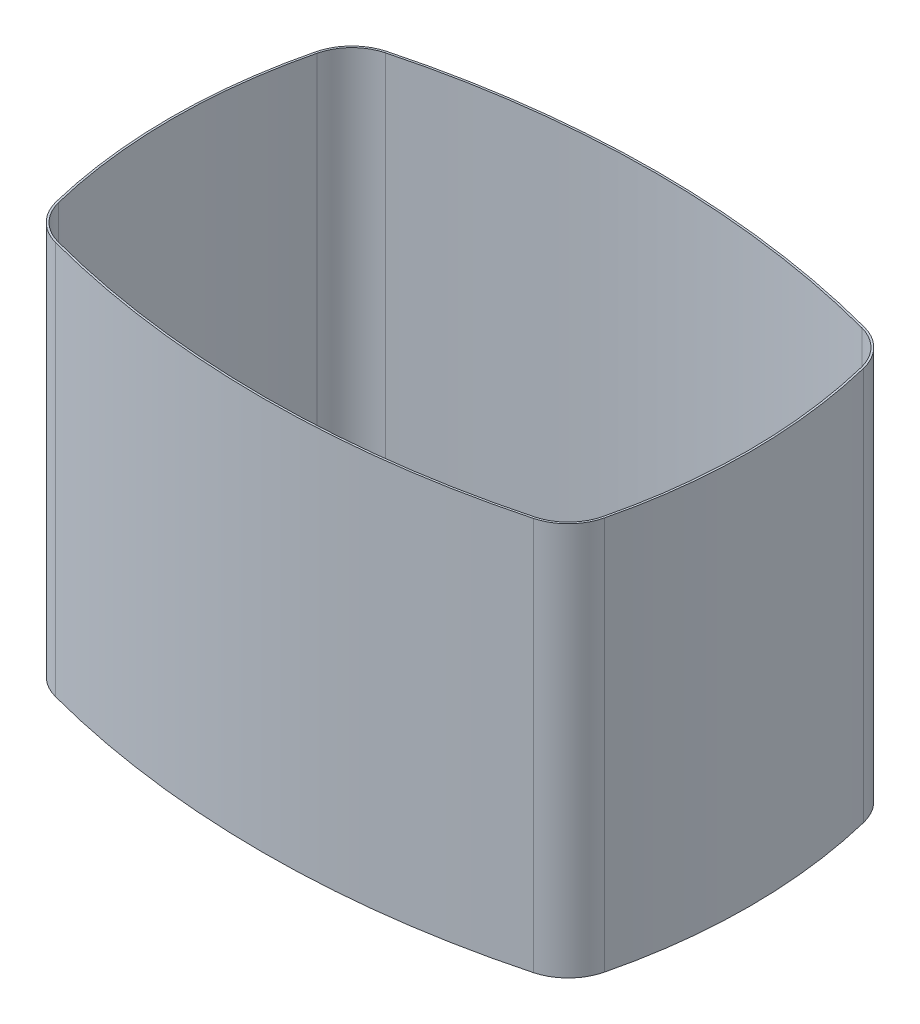
ISO-10303-21;
HEADER;
FILE_DESCRIPTION(('STEP AP214'),'2;1');
FILE_NAME('part.step','',(''),(''),'','','');
FILE_SCHEMA(('AUTOMOTIVE_DESIGN { 1 0 10303 214 1 1 1 1 }'));
ENDSEC;
DATA;
#1=APPLICATION_CONTEXT('core data for automotive mechanical design processes');
#2=APPLICATION_PROTOCOL_DEFINITION('international standard','automotive_design',2000,#1);
#3=PRODUCT_CONTEXT('',#1,'mechanical');
#4=PRODUCT('Part','Part','',(#3));
#5=PRODUCT_RELATED_PRODUCT_CATEGORY('part','',(#4));
#6=PRODUCT_DEFINITION_FORMATION('','',#4);
#7=PRODUCT_DEFINITION_CONTEXT('part definition',#1,'design');
#8=PRODUCT_DEFINITION('design','',#6,#7);
#9=PRODUCT_DEFINITION_SHAPE('','',#8);
#10=(LENGTH_UNIT() NAMED_UNIT(*) SI_UNIT(.MILLI.,.METRE.));
#11=(NAMED_UNIT(*) PLANE_ANGLE_UNIT() SI_UNIT($,.RADIAN.));
#12=(NAMED_UNIT(*) SI_UNIT($,.STERADIAN.) SOLID_ANGLE_UNIT());
#13=UNCERTAINTY_MEASURE_WITH_UNIT(LENGTH_MEASURE(1.E-05),#10,'distance_accuracy_value','');
#14=(GEOMETRIC_REPRESENTATION_CONTEXT(3) GLOBAL_UNCERTAINTY_ASSIGNED_CONTEXT((#13)) GLOBAL_UNIT_ASSIGNED_CONTEXT((#10,
#11,#12)) REPRESENTATION_CONTEXT('',''));
#15=CARTESIAN_POINT('',(0.,0.,0.));
#16=DIRECTION('',(0.,0.,1.));
#17=DIRECTION('',(1.,0.,0.));
#18=AXIS2_PLACEMENT_3D('',#15,#16,#17);
#19=CARTESIAN_POINT('',(0.,200.,373.542201676667));
#20=DIRECTION('',(0.,-1.,0.));
#21=DIRECTION('',(0.,0.,-1.));
#22=AXIS2_PLACEMENT_3D('',#19,#20,#21);
#23=CYLINDRICAL_SURFACE('',#22,473.535216716204);
#24=CARTESIAN_POINT('',(0.,0.,373.542201676667));
#25=DIRECTION('',(0.,1.,0.));
#26=DIRECTION('',(0.,0.,-1.));
#27=AXIS2_PLACEMENT_3D('',#24,#25,#26);
#28=CIRCLE('',#27,473.535216716204);
#29=CARTESIAN_POINT('',(121.409753109351,0.,-84.1643345672329));
#30=VERTEX_POINT('',#29);
#31=CARTESIAN_POINT('',(-121.409753109351,0.,-84.1643345672329));
#32=VERTEX_POINT('',#31);
#33=EDGE_CURVE('E188',#30,#32,#28,.T.);
#34=ORIENTED_EDGE('',*,*,#33,.T.);
#35=DIRECTION('',(0.,-1.,0.));
#36=VECTOR('',#35,1.);
#37=CARTESIAN_POINT('',(-121.409753109351,200.,-84.1643345672329));
#38=LINE('',#37,#36);
#39=CARTESIAN_POINT('',(-121.409753109351,200.,-84.1643345672329));
#40=VERTEX_POINT('',#39);
#41=EDGE_CURVE('E11',#40,#32,#38,.T.);
#42=ORIENTED_EDGE('',*,*,#41,.F.);
#43=CARTESIAN_POINT('',(0.,200.,373.542201676667));
#44=DIRECTION('',(0.,1.,0.));
#45=DIRECTION('',(0.,0.,-1.));
#46=AXIS2_PLACEMENT_3D('',#43,#44,#45);
#47=CIRCLE('',#46,473.535216716204);
#48=CARTESIAN_POINT('',(121.409753109351,200.,-84.1643345672329));
#49=VERTEX_POINT('',#48);
#50=EDGE_CURVE('E215',#49,#40,#47,.T.);
#51=ORIENTED_EDGE('',*,*,#50,.F.);
#52=DIRECTION('',(0.,-1.,0.));
#53=VECTOR('',#52,1.);
#54=CARTESIAN_POINT('',(121.409753109351,200.,-84.1643345672329));
#55=LINE('',#54,#53);
#56=EDGE_CURVE('E233',#49,#30,#55,.T.);
#57=ORIENTED_EDGE('',*,*,#56,.T.);
#58=EDGE_LOOP('',(#34,#42,#51,#57));
#59=FACE_BOUND('',#58,.T.);
#60=ADVANCED_FACE('F39',(#59),#23,.T.);
#61=CARTESIAN_POINT('',(-115.,200.,-60.));
#62=DIRECTION('',(0.,-1.,0.));
#63=DIRECTION('',(0.,0.,-1.));
#64=AXIS2_PLACEMENT_3D('',#61,#62,#63);
#65=CYLINDRICAL_SURFACE('',#64,25.);
#66=CARTESIAN_POINT('',(-115.,0.,-60.));
#67=DIRECTION('',(0.,1.,0.));
#68=DIRECTION('',(0.,0.,1.));
#69=AXIS2_PLACEMENT_3D('',#66,#67,#68);
#70=CIRCLE('',#69,25.);
#71=CARTESIAN_POINT('',(-139.283044384888,0.,-65.9442203358842));
#72=VERTEX_POINT('',#71);
#73=EDGE_CURVE('E236',#32,#72,#70,.T.);
#74=ORIENTED_EDGE('',*,*,#73,.T.);
#75=DIRECTION('',(0.,-1.,0.));
#76=VECTOR('',#75,1.);
#77=CARTESIAN_POINT('',(-139.283044384888,200.,-65.9442203358842));
#78=LINE('',#77,#76);
#79=CARTESIAN_POINT('',(-139.283044384888,200.,-65.9442203358842));
#80=VERTEX_POINT('',#79);
#81=EDGE_CURVE('E46',#80,#72,#78,.T.);
#82=ORIENTED_EDGE('',*,*,#81,.F.);
#83=CARTESIAN_POINT('',(-115.,200.,-60.));
#84=DIRECTION('',(0.,1.,0.));
#85=DIRECTION('',(0.,0.,1.));
#86=AXIS2_PLACEMENT_3D('',#83,#84,#85);
#87=CIRCLE('',#86,25.);
#88=EDGE_CURVE('E218',#40,#80,#87,.T.);
#89=ORIENTED_EDGE('',*,*,#88,.F.);
#90=ORIENTED_EDGE('',*,*,#41,.T.);
#91=EDGE_LOOP('',(#74,#82,#89,#90));
#92=FACE_BOUND('',#91,.T.);
#93=ADVANCED_FACE('F291',(#92),#65,.T.);
#94=CARTESIAN_POINT('',(130.109127987361,200.,0.));
#95=DIRECTION('',(0.,-1.,0.));
#96=DIRECTION('',(0.,0.,-1.));
#97=AXIS2_PLACEMENT_3D('',#94,#95,#96);
#98=CYLINDRICAL_SURFACE('',#97,277.345962168457);
#99=CARTESIAN_POINT('',(130.109127987361,0.,0.));
#100=DIRECTION('',(0.,1.,0.));
#101=DIRECTION('',(0.,0.,1.));
#102=AXIS2_PLACEMENT_3D('',#99,#100,#101);
#103=CIRCLE('',#102,277.345962168457);
#104=CARTESIAN_POINT('',(-139.283044384888,0.,65.944220335884));
#105=VERTEX_POINT('',#104);
#106=EDGE_CURVE('E238',#72,#105,#103,.T.);
#107=ORIENTED_EDGE('',*,*,#106,.T.);
#108=DIRECTION('',(0.,-1.,0.));
#109=VECTOR('',#108,1.);
#110=CARTESIAN_POINT('',(-139.283044384888,200.,65.944220335884));
#111=LINE('',#110,#109);
#112=CARTESIAN_POINT('',(-139.283044384888,200.,65.944220335884));
#113=VERTEX_POINT('',#112);
#114=EDGE_CURVE('E263',#113,#105,#111,.T.);
#115=ORIENTED_EDGE('',*,*,#114,.F.);
#116=CARTESIAN_POINT('',(130.109127987361,200.,0.));
#117=DIRECTION('',(0.,1.,0.));
#118=DIRECTION('',(0.,0.,1.));
#119=AXIS2_PLACEMENT_3D('',#116,#117,#118);
#120=CIRCLE('',#119,277.345962168457);
#121=EDGE_CURVE('E221',#80,#113,#120,.T.);
#122=ORIENTED_EDGE('',*,*,#121,.F.);
#123=ORIENTED_EDGE('',*,*,#81,.T.);
#124=EDGE_LOOP('',(#107,#115,#122,#123));
#125=FACE_BOUND('',#124,.T.);
#126=ADVANCED_FACE('F270',(#125),#98,.T.);
#127=CARTESIAN_POINT('',(-115.,200.,60.));
#128=DIRECTION('',(0.,-1.,0.));
#129=DIRECTION('',(0.,0.,-1.));
#130=AXIS2_PLACEMENT_3D('',#127,#128,#129);
#131=CYLINDRICAL_SURFACE('',#130,25.);
#132=CARTESIAN_POINT('',(-115.,0.,60.));
#133=DIRECTION('',(0.,1.,0.));
#134=DIRECTION('',(0.,0.,-1.));
#135=AXIS2_PLACEMENT_3D('',#132,#133,#134);
#136=CIRCLE('',#135,25.);
#137=CARTESIAN_POINT('',(-121.409753109351,0.,84.1643345672329));
#138=VERTEX_POINT('',#137);
#139=EDGE_CURVE('E240',#105,#138,#136,.T.);
#140=ORIENTED_EDGE('',*,*,#139,.T.);
#141=DIRECTION('',(0.,-1.,0.));
#142=VECTOR('',#141,1.);
#143=CARTESIAN_POINT('',(-121.409753109351,200.,84.1643345672329));
#144=LINE('',#143,#142);
#145=CARTESIAN_POINT('',(-121.409753109351,200.,84.1643345672329));
#146=VERTEX_POINT('',#145);
#147=EDGE_CURVE('E260',#146,#138,#144,.T.);
#148=ORIENTED_EDGE('',*,*,#147,.F.);
#149=CARTESIAN_POINT('',(-115.,200.,60.));
#150=DIRECTION('',(0.,1.,0.));
#151=DIRECTION('',(0.,0.,-1.));
#152=AXIS2_PLACEMENT_3D('',#149,#150,#151);
#153=CIRCLE('',#152,25.);
#154=EDGE_CURVE('E223',#113,#146,#153,.T.);
#155=ORIENTED_EDGE('',*,*,#154,.F.);
#156=ORIENTED_EDGE('',*,*,#114,.T.);
#157=EDGE_LOOP('',(#140,#148,#155,#156));
#158=FACE_BOUND('',#157,.T.);
#159=ADVANCED_FACE('F279',(#158),#131,.T.);
#160=CARTESIAN_POINT('',(0.,200.,-373.542201676667));
#161=DIRECTION('',(0.,-1.,0.));
#162=DIRECTION('',(0.,0.,-1.));
#163=AXIS2_PLACEMENT_3D('',#160,#161,#162);
#164=CYLINDRICAL_SURFACE('',#163,473.535216716204);
#165=CARTESIAN_POINT('',(0.,0.,-373.542201676667));
#166=DIRECTION('',(0.,1.,0.));
#167=DIRECTION('',(0.,0.,1.));
#168=AXIS2_PLACEMENT_3D('',#165,#166,#167);
#169=CIRCLE('',#168,473.535216716204);
#170=CARTESIAN_POINT('',(121.409753109351,0.,84.1643345672329));
#171=VERTEX_POINT('',#170);
#172=EDGE_CURVE('E242',#138,#171,#169,.T.);
#173=ORIENTED_EDGE('',*,*,#172,.T.);
#174=DIRECTION('',(0.,-1.,0.));
#175=VECTOR('',#174,1.);
#176=CARTESIAN_POINT('',(121.409753109351,200.,84.1643345672329));
#177=LINE('',#176,#175);
#178=CARTESIAN_POINT('',(121.409753109351,200.,84.1643345672329));
#179=VERTEX_POINT('',#178);
#180=EDGE_CURVE('E257',#179,#171,#177,.T.);
#181=ORIENTED_EDGE('',*,*,#180,.F.);
#182=CARTESIAN_POINT('',(0.,200.,-373.542201676667));
#183=DIRECTION('',(0.,1.,0.));
#184=DIRECTION('',(0.,0.,1.));
#185=AXIS2_PLACEMENT_3D('',#182,#183,#184);
#186=CIRCLE('',#185,473.535216716204);
#187=EDGE_CURVE('E225',#146,#179,#186,.T.);
#188=ORIENTED_EDGE('',*,*,#187,.F.);
#189=ORIENTED_EDGE('',*,*,#147,.T.);
#190=EDGE_LOOP('',(#173,#181,#188,#189));
#191=FACE_BOUND('',#190,.T.);
#192=ADVANCED_FACE('F283',(#191),#164,.T.);
#193=CARTESIAN_POINT('',(115.,200.,60.));
#194=DIRECTION('',(0.,-1.,0.));
#195=DIRECTION('',(0.,0.,-1.));
#196=AXIS2_PLACEMENT_3D('',#193,#194,#195);
#197=CYLINDRICAL_SURFACE('',#196,25.);
#198=CARTESIAN_POINT('',(115.,0.,60.));
#199=DIRECTION('',(0.,1.,0.));
#200=DIRECTION('',(0.,0.,1.));
#201=AXIS2_PLACEMENT_3D('',#198,#199,#200);
#202=CIRCLE('',#201,25.);
#203=CARTESIAN_POINT('',(139.283044384889,0.,65.9442203358839));
#204=VERTEX_POINT('',#203);
#205=EDGE_CURVE('E244',#171,#204,#202,.T.);
#206=ORIENTED_EDGE('',*,*,#205,.T.);
#207=DIRECTION('',(0.,-1.,0.));
#208=VECTOR('',#207,1.);
#209=CARTESIAN_POINT('',(139.283044384889,200.,65.9442203358839));
#210=LINE('',#209,#208);
#211=CARTESIAN_POINT('',(139.283044384889,200.,65.9442203358839));
#212=VERTEX_POINT('',#211);
#213=EDGE_CURVE('E254',#212,#204,#210,.T.);
#214=ORIENTED_EDGE('',*,*,#213,.F.);
#215=CARTESIAN_POINT('',(115.,200.,60.));
#216=DIRECTION('',(0.,1.,0.));
#217=DIRECTION('',(0.,0.,1.));
#218=AXIS2_PLACEMENT_3D('',#215,#216,#217);
#219=CIRCLE('',#218,25.);
#220=EDGE_CURVE('E227',#179,#212,#219,.T.);
#221=ORIENTED_EDGE('',*,*,#220,.F.);
#222=ORIENTED_EDGE('',*,*,#180,.T.);
#223=EDGE_LOOP('',(#206,#214,#221,#222));
#224=FACE_BOUND('',#223,.T.);
#225=ADVANCED_FACE('F304',(#224),#197,.T.);
#226=CARTESIAN_POINT('',(-130.109127987361,200.,1.13436230767317E-13));
#227=DIRECTION('',(0.,-1.,0.));
#228=DIRECTION('',(0.,0.,-1.));
#229=AXIS2_PLACEMENT_3D('',#226,#227,#228);
#230=CYLINDRICAL_SURFACE('',#229,277.345962168457);
#231=CARTESIAN_POINT('',(-130.109127987361,0.,1.13436230767317E-13));
#232=DIRECTION('',(0.,1.,0.));
#233=DIRECTION('',(0.,0.,-1.));
#234=AXIS2_PLACEMENT_3D('',#231,#232,#233);
#235=CIRCLE('',#234,277.345962168457);
#236=CARTESIAN_POINT('',(139.283044384888,0.,-65.9442203358842));
#237=VERTEX_POINT('',#236);
#238=EDGE_CURVE('E246',#204,#237,#235,.T.);
#239=ORIENTED_EDGE('',*,*,#238,.T.);
#240=DIRECTION('',(0.,-1.,0.));
#241=VECTOR('',#240,1.);
#242=CARTESIAN_POINT('',(139.283044384888,200.,-65.9442203358842));
#243=LINE('',#242,#241);
#244=CARTESIAN_POINT('',(139.283044384888,200.,-65.9442203358842));
#245=VERTEX_POINT('',#244);
#246=EDGE_CURVE('E251',#245,#237,#243,.T.);
#247=ORIENTED_EDGE('',*,*,#246,.F.);
#248=CARTESIAN_POINT('',(-130.109127987361,200.,1.13436230767317E-13));
#249=DIRECTION('',(0.,1.,0.));
#250=DIRECTION('',(0.,0.,-1.));
#251=AXIS2_PLACEMENT_3D('',#248,#249,#250);
#252=CIRCLE('',#251,277.345962168457);
#253=EDGE_CURVE('E229',#212,#245,#252,.T.);
#254=ORIENTED_EDGE('',*,*,#253,.F.);
#255=ORIENTED_EDGE('',*,*,#213,.T.);
#256=EDGE_LOOP('',(#239,#247,#254,#255));
#257=FACE_BOUND('',#256,.T.);
#258=ADVANCED_FACE('F302',(#257),#230,.T.);
#259=CARTESIAN_POINT('',(115.,200.,-60.));
#260=DIRECTION('',(0.,-1.,0.));
#261=DIRECTION('',(0.,0.,-1.));
#262=AXIS2_PLACEMENT_3D('',#259,#260,#261);
#263=CYLINDRICAL_SURFACE('',#262,25.);
#264=CARTESIAN_POINT('',(115.,0.,-60.));
#265=DIRECTION('',(0.,1.,0.));
#266=DIRECTION('',(0.,0.,-1.));
#267=AXIS2_PLACEMENT_3D('',#264,#265,#266);
#268=CIRCLE('',#267,25.);
#269=EDGE_CURVE('E219',#237,#30,#268,.T.);
#270=ORIENTED_EDGE('',*,*,#269,.T.);
#271=ORIENTED_EDGE('',*,*,#56,.F.);
#272=CARTESIAN_POINT('',(115.,200.,-60.));
#273=DIRECTION('',(0.,1.,0.));
#274=DIRECTION('',(0.,0.,-1.));
#275=AXIS2_PLACEMENT_3D('',#272,#273,#274);
#276=CIRCLE('',#275,25.);
#277=EDGE_CURVE('E231',#245,#49,#276,.T.);
#278=ORIENTED_EDGE('',*,*,#277,.F.);
#279=ORIENTED_EDGE('',*,*,#246,.T.);
#280=EDGE_LOOP('',(#270,#271,#278,#279));
#281=FACE_BOUND('',#280,.T.);
#282=ADVANCED_FACE('F297',(#281),#263,.T.);
#283=CARTESIAN_POINT('',(57.5,200.,156.771100838334));
#284=DIRECTION('',(0.,-1.,0.));
#285=DIRECTION('',(0.,0.,-1.));
#286=AXIS2_PLACEMENT_3D('',#283,#284,#285);
#287=PLANE('',#286);
#288=CARTESIAN_POINT('',(0.,200.,373.542201676667));
#289=DIRECTION('',(0.,-1.,0.));
#290=DIRECTION('',(0.,0.,-1.));
#291=AXIS2_PLACEMENT_3D('',#288,#289,#290);
#292=CIRCLE('',#291,472.535216716204);
#293=CARTESIAN_POINT('',(121.153362984977,200.,-83.1977611845436));
#294=VERTEX_POINT('',#293);
#295=CARTESIAN_POINT('',(-121.153362984977,200.,-83.1977611845436));
#296=VERTEX_POINT('',#295);
#297=EDGE_CURVE('E187',#294,#296,#292,.F.);
#298=ORIENTED_EDGE('',*,*,#297,.F.);
#299=CARTESIAN_POINT('',(115.,200.,-60.));
#300=DIRECTION('',(0.,-1.,0.));
#301=DIRECTION('',(0.,0.,-1.));
#302=AXIS2_PLACEMENT_3D('',#299,#300,#301);
#303=CIRCLE('',#302,24.);
#304=CARTESIAN_POINT('',(138.311722609493,200.,-65.7064515224489));
#305=VERTEX_POINT('',#304);
#306=EDGE_CURVE('E156',#305,#294,#303,.F.);
#307=ORIENTED_EDGE('',*,*,#306,.F.);
#308=CARTESIAN_POINT('',(-130.109127987361,200.,1.13436230767317E-13));
#309=DIRECTION('',(0.,-1.,0.));
#310=DIRECTION('',(0.,0.,-1.));
#311=AXIS2_PLACEMENT_3D('',#308,#309,#310);
#312=CIRCLE('',#311,276.345962168457);
#313=CARTESIAN_POINT('',(138.311722609493,200.,65.7064515224486));
#314=VERTEX_POINT('',#313);
#315=EDGE_CURVE('E212',#314,#305,#312,.F.);
#316=ORIENTED_EDGE('',*,*,#315,.F.);
#317=CARTESIAN_POINT('',(115.,200.,60.));
#318=DIRECTION('',(0.,-1.,0.));
#319=DIRECTION('',(0.,0.,-1.));
#320=AXIS2_PLACEMENT_3D('',#317,#318,#319);
#321=CIRCLE('',#320,24.);
#322=CARTESIAN_POINT('',(121.153362984977,200.,83.1977611845436));
#323=VERTEX_POINT('',#322);
#324=EDGE_CURVE('E210',#323,#314,#321,.F.);
#325=ORIENTED_EDGE('',*,*,#324,.F.);
#326=CARTESIAN_POINT('',(0.,200.,-373.542201676667));
#327=DIRECTION('',(0.,-1.,0.));
#328=DIRECTION('',(0.,0.,-1.));
#329=AXIS2_PLACEMENT_3D('',#326,#327,#328);
#330=CIRCLE('',#329,472.535216716204);
#331=CARTESIAN_POINT('',(-121.153362984977,200.,83.1977611845436));
#332=VERTEX_POINT('',#331);
#333=EDGE_CURVE('E208',#332,#323,#330,.F.);
#334=ORIENTED_EDGE('',*,*,#333,.F.);
#335=CARTESIAN_POINT('',(-115.,200.,60.));
#336=DIRECTION('',(0.,-1.,0.));
#337=DIRECTION('',(0.,0.,-1.));
#338=AXIS2_PLACEMENT_3D('',#335,#336,#337);
#339=CIRCLE('',#338,24.);
#340=CARTESIAN_POINT('',(-138.311722609493,200.,65.7064515224487));
#341=VERTEX_POINT('',#340);
#342=EDGE_CURVE('E206',#341,#332,#339,.F.);
#343=ORIENTED_EDGE('',*,*,#342,.F.);
#344=CARTESIAN_POINT('',(130.109127987361,200.,0.));
#345=DIRECTION('',(0.,-1.,0.));
#346=DIRECTION('',(0.,0.,-1.));
#347=AXIS2_PLACEMENT_3D('',#344,#345,#346);
#348=CIRCLE('',#347,276.345962168457);
#349=CARTESIAN_POINT('',(-138.311722609493,200.,-65.7064515224488));
#350=VERTEX_POINT('',#349);
#351=EDGE_CURVE('E204',#350,#341,#348,.F.);
#352=ORIENTED_EDGE('',*,*,#351,.F.);
#353=CARTESIAN_POINT('',(-115.,200.,-60.));
#354=DIRECTION('',(0.,-1.,0.));
#355=DIRECTION('',(0.,0.,-1.));
#356=AXIS2_PLACEMENT_3D('',#353,#354,#355);
#357=CIRCLE('',#356,24.);
#358=EDGE_CURVE('E202',#296,#350,#357,.F.);
#359=ORIENTED_EDGE('',*,*,#358,.F.);
#360=EDGE_LOOP('',(#298,#307,#316,#325,#334,#343,#352,#359));
#361=FACE_BOUND('',#360,.T.);
#362=ORIENTED_EDGE('',*,*,#50,.T.);
#363=ORIENTED_EDGE('',*,*,#88,.T.);
#364=ORIENTED_EDGE('',*,*,#121,.T.);
#365=ORIENTED_EDGE('',*,*,#154,.T.);
#366=ORIENTED_EDGE('',*,*,#187,.T.);
#367=ORIENTED_EDGE('',*,*,#220,.T.);
#368=ORIENTED_EDGE('',*,*,#253,.T.);
#369=ORIENTED_EDGE('',*,*,#277,.T.);
#370=EDGE_LOOP('',(#362,#363,#364,#365,#366,#367,#368,#369));
#371=FACE_BOUND('',#370,.T.);
#372=ADVANCED_FACE('F287',(#361,#371),#287,.F.);
#373=CARTESIAN_POINT('',(57.5,0.,156.771100838334));
#374=DIRECTION('',(0.,-1.,0.));
#375=DIRECTION('',(0.,0.,-1.));
#376=AXIS2_PLACEMENT_3D('',#373,#374,#375);
#377=PLANE('',#376);
#378=CARTESIAN_POINT('',(-115.,0.,-60.));
#379=DIRECTION('',(0.,-1.,0.));
#380=DIRECTION('',(0.,0.,-1.));
#381=AXIS2_PLACEMENT_3D('',#378,#379,#380);
#382=CIRCLE('',#381,24.);
#383=CARTESIAN_POINT('',(-138.311722609493,0.,-65.7064515224486));
#384=VERTEX_POINT('',#383);
#385=CARTESIAN_POINT('',(-121.153362984977,0.,-83.1977611845436));
#386=VERTEX_POINT('',#385);
#387=EDGE_CURVE('E164',#384,#386,#382,.T.);
#388=ORIENTED_EDGE('',*,*,#387,.F.);
#389=CARTESIAN_POINT('',(130.109127987361,0.,0.));
#390=DIRECTION('',(0.,-1.,0.));
#391=DIRECTION('',(0.,0.,-1.));
#392=AXIS2_PLACEMENT_3D('',#389,#390,#391);
#393=CIRCLE('',#392,276.345962168457);
#394=CARTESIAN_POINT('',(-138.311722609493,0.,65.7064515224486));
#395=VERTEX_POINT('',#394);
#396=EDGE_CURVE('E184',#395,#384,#393,.T.);
#397=ORIENTED_EDGE('',*,*,#396,.F.);
#398=CARTESIAN_POINT('',(-115.,0.,60.));
#399=DIRECTION('',(0.,-1.,0.));
#400=DIRECTION('',(0.,0.,-1.));
#401=AXIS2_PLACEMENT_3D('',#398,#399,#400);
#402=CIRCLE('',#401,24.);
#403=CARTESIAN_POINT('',(-121.153362984977,0.,83.1977611845436));
#404=VERTEX_POINT('',#403);
#405=EDGE_CURVE('E181',#404,#395,#402,.T.);
#406=ORIENTED_EDGE('',*,*,#405,.F.);
#407=CARTESIAN_POINT('',(0.,0.,-373.542201676667));
#408=DIRECTION('',(0.,-1.,0.));
#409=DIRECTION('',(0.,0.,-1.));
#410=AXIS2_PLACEMENT_3D('',#407,#408,#409);
#411=CIRCLE('',#410,472.535216716204);
#412=CARTESIAN_POINT('',(121.153362984977,0.,83.1977611845437));
#413=VERTEX_POINT('',#412);
#414=EDGE_CURVE('E178',#413,#404,#411,.T.);
#415=ORIENTED_EDGE('',*,*,#414,.F.);
#416=CARTESIAN_POINT('',(115.,0.,60.));
#417=DIRECTION('',(0.,-1.,0.));
#418=DIRECTION('',(0.,0.,-1.));
#419=AXIS2_PLACEMENT_3D('',#416,#417,#418);
#420=CIRCLE('',#419,24.);
#421=CARTESIAN_POINT('',(138.311722609493,0.,65.7064515224486));
#422=VERTEX_POINT('',#421);
#423=EDGE_CURVE('E172',#422,#413,#420,.T.);
#424=ORIENTED_EDGE('',*,*,#423,.F.);
#425=CARTESIAN_POINT('',(-130.109127987361,0.,1.13436230767317E-13));
#426=DIRECTION('',(0.,-1.,0.));
#427=DIRECTION('',(0.,0.,-1.));
#428=AXIS2_PLACEMENT_3D('',#425,#426,#427);
#429=CIRCLE('',#428,276.345962168457);
#430=CARTESIAN_POINT('',(138.311722609493,0.,-65.7064515224489));
#431=VERTEX_POINT('',#430);
#432=EDGE_CURVE('E170',#431,#422,#429,.T.);
#433=ORIENTED_EDGE('',*,*,#432,.F.);
#434=CARTESIAN_POINT('',(115.,0.,-60.));
#435=DIRECTION('',(0.,-1.,0.));
#436=DIRECTION('',(0.,0.,-1.));
#437=AXIS2_PLACEMENT_3D('',#434,#435,#436);
#438=CIRCLE('',#437,24.);
#439=CARTESIAN_POINT('',(121.153362984977,0.,-83.1977611845437));
#440=VERTEX_POINT('',#439);
#441=EDGE_CURVE('E153',#440,#431,#438,.T.);
#442=ORIENTED_EDGE('',*,*,#441,.F.);
#443=CARTESIAN_POINT('',(0.,0.,373.542201676667));
#444=DIRECTION('',(0.,-1.,0.));
#445=DIRECTION('',(0.,0.,-1.));
#446=AXIS2_PLACEMENT_3D('',#443,#444,#445);
#447=CIRCLE('',#446,472.535216716204);
#448=EDGE_CURVE('E160',#386,#440,#447,.T.);
#449=ORIENTED_EDGE('',*,*,#448,.F.);
#450=EDGE_LOOP('',(#388,#397,#406,#415,#424,#433,#442,#449));
#451=FACE_BOUND('',#450,.T.);
#452=ORIENTED_EDGE('',*,*,#33,.F.);
#453=ORIENTED_EDGE('',*,*,#269,.F.);
#454=ORIENTED_EDGE('',*,*,#238,.F.);
#455=ORIENTED_EDGE('',*,*,#205,.F.);
#456=ORIENTED_EDGE('',*,*,#172,.F.);
#457=ORIENTED_EDGE('',*,*,#139,.F.);
#458=ORIENTED_EDGE('',*,*,#106,.F.);
#459=ORIENTED_EDGE('',*,*,#73,.F.);
#460=EDGE_LOOP('',(#452,#453,#454,#455,#456,#457,#458,#459));
#461=FACE_BOUND('',#460,.T.);
#462=ADVANCED_FACE('F166',(#451,#461),#377,.T.);
#463=CARTESIAN_POINT('',(0.,200.,373.542201676667));
#464=DIRECTION('',(0.,-1.,0.));
#465=DIRECTION('',(0.,0.,-1.));
#466=AXIS2_PLACEMENT_3D('',#463,#464,#465);
#467=CYLINDRICAL_SURFACE('',#466,472.535216716204);
#468=DIRECTION('',(0.,-1.,0.));
#469=VECTOR('',#468,1.);
#470=CARTESIAN_POINT('',(-121.153362984977,200.,-83.1977611845436));
#471=LINE('',#470,#469);
#472=EDGE_CURVE('E53',#296,#386,#471,.T.);
#473=ORIENTED_EDGE('',*,*,#472,.T.);
#474=ORIENTED_EDGE('',*,*,#448,.T.);
#475=DIRECTION('',(0.,-1.,0.));
#476=VECTOR('',#475,1.);
#477=CARTESIAN_POINT('',(121.153362984977,200.,-83.1977611845436));
#478=LINE('',#477,#476);
#479=EDGE_CURVE('E150',#294,#440,#478,.T.);
#480=ORIENTED_EDGE('',*,*,#479,.F.);
#481=ORIENTED_EDGE('',*,*,#297,.T.);
#482=EDGE_LOOP('',(#473,#474,#480,#481));
#483=FACE_BOUND('',#482,.T.);
#484=ADVANCED_FACE('F161',(#483),#467,.F.);
#485=CARTESIAN_POINT('',(-115.,200.,-60.));
#486=DIRECTION('',(0.,-1.,0.));
#487=DIRECTION('',(0.,0.,-1.));
#488=AXIS2_PLACEMENT_3D('',#485,#486,#487);
#489=CYLINDRICAL_SURFACE('',#488,24.);
#490=DIRECTION('',(0.,-1.,0.));
#491=VECTOR('',#490,1.);
#492=CARTESIAN_POINT('',(-138.311722609493,200.,-65.7064515224489));
#493=LINE('',#492,#491);
#494=EDGE_CURVE('E189',#350,#384,#493,.T.);
#495=ORIENTED_EDGE('',*,*,#494,.T.);
#496=ORIENTED_EDGE('',*,*,#387,.T.);
#497=ORIENTED_EDGE('',*,*,#472,.F.);
#498=ORIENTED_EDGE('',*,*,#358,.T.);
#499=EDGE_LOOP('',(#495,#496,#497,#498));
#500=FACE_BOUND('',#499,.T.);
#501=ADVANCED_FACE('F382',(#500),#489,.F.);
#502=CARTESIAN_POINT('',(130.109127987361,200.,0.));
#503=DIRECTION('',(0.,-1.,0.));
#504=DIRECTION('',(0.,0.,-1.));
#505=AXIS2_PLACEMENT_3D('',#502,#503,#504);
#506=CYLINDRICAL_SURFACE('',#505,276.345962168457);
#507=DIRECTION('',(0.,-1.,0.));
#508=VECTOR('',#507,1.);
#509=CARTESIAN_POINT('',(-138.311722609493,200.,65.7064515224486));
#510=LINE('',#509,#508);
#511=EDGE_CURVE('E192',#341,#395,#510,.T.);
#512=ORIENTED_EDGE('',*,*,#511,.T.);
#513=ORIENTED_EDGE('',*,*,#396,.T.);
#514=ORIENTED_EDGE('',*,*,#494,.F.);
#515=ORIENTED_EDGE('',*,*,#351,.T.);
#516=EDGE_LOOP('',(#512,#513,#514,#515));
#517=FACE_BOUND('',#516,.T.);
#518=ADVANCED_FACE('F392',(#517),#506,.F.);
#519=CARTESIAN_POINT('',(-115.,200.,60.));
#520=DIRECTION('',(0.,-1.,0.));
#521=DIRECTION('',(0.,0.,-1.));
#522=AXIS2_PLACEMENT_3D('',#519,#520,#521);
#523=CYLINDRICAL_SURFACE('',#522,24.);
#524=DIRECTION('',(0.,-1.,0.));
#525=VECTOR('',#524,1.);
#526=CARTESIAN_POINT('',(-121.153362984977,200.,83.1977611845436));
#527=LINE('',#526,#525);
#528=EDGE_CURVE('E194',#332,#404,#527,.T.);
#529=ORIENTED_EDGE('',*,*,#528,.T.);
#530=ORIENTED_EDGE('',*,*,#405,.T.);
#531=ORIENTED_EDGE('',*,*,#511,.F.);
#532=ORIENTED_EDGE('',*,*,#342,.T.);
#533=EDGE_LOOP('',(#529,#530,#531,#532));
#534=FACE_BOUND('',#533,.T.);
#535=ADVANCED_FACE('F403',(#534),#523,.F.);
#536=CARTESIAN_POINT('',(0.,200.,-373.542201676667));
#537=DIRECTION('',(0.,-1.,0.));
#538=DIRECTION('',(0.,0.,-1.));
#539=AXIS2_PLACEMENT_3D('',#536,#537,#538);
#540=CYLINDRICAL_SURFACE('',#539,472.535216716204);
#541=DIRECTION('',(0.,-1.,0.));
#542=VECTOR('',#541,1.);
#543=CARTESIAN_POINT('',(121.153362984977,200.,83.1977611845437));
#544=LINE('',#543,#542);
#545=EDGE_CURVE('E196',#323,#413,#544,.T.);
#546=ORIENTED_EDGE('',*,*,#545,.T.);
#547=ORIENTED_EDGE('',*,*,#414,.T.);
#548=ORIENTED_EDGE('',*,*,#528,.F.);
#549=ORIENTED_EDGE('',*,*,#333,.T.);
#550=EDGE_LOOP('',(#546,#547,#548,#549));
#551=FACE_BOUND('',#550,.T.);
#552=ADVANCED_FACE('F414',(#551),#540,.F.);
#553=CARTESIAN_POINT('',(115.,200.,60.));
#554=DIRECTION('',(0.,-1.,0.));
#555=DIRECTION('',(0.,0.,-1.));
#556=AXIS2_PLACEMENT_3D('',#553,#554,#555);
#557=CYLINDRICAL_SURFACE('',#556,24.);
#558=DIRECTION('',(0.,-1.,0.));
#559=VECTOR('',#558,1.);
#560=CARTESIAN_POINT('',(138.311722609493,200.,65.7064515224486));
#561=LINE('',#560,#559);
#562=EDGE_CURVE('E198',#314,#422,#561,.T.);
#563=ORIENTED_EDGE('',*,*,#562,.T.);
#564=ORIENTED_EDGE('',*,*,#423,.T.);
#565=ORIENTED_EDGE('',*,*,#545,.F.);
#566=ORIENTED_EDGE('',*,*,#324,.T.);
#567=EDGE_LOOP('',(#563,#564,#565,#566));
#568=FACE_BOUND('',#567,.T.);
#569=ADVANCED_FACE('F425',(#568),#557,.F.);
#570=CARTESIAN_POINT('',(-130.109127987361,200.,1.13436230767317E-13));
#571=DIRECTION('',(0.,-1.,0.));
#572=DIRECTION('',(0.,0.,-1.));
#573=AXIS2_PLACEMENT_3D('',#570,#571,#572);
#574=CYLINDRICAL_SURFACE('',#573,276.345962168457);
#575=DIRECTION('',(0.,-1.,0.));
#576=VECTOR('',#575,1.);
#577=CARTESIAN_POINT('',(138.311722609493,200.,-65.7064515224489));
#578=LINE('',#577,#576);
#579=EDGE_CURVE('E61',#305,#431,#578,.T.);
#580=ORIENTED_EDGE('',*,*,#579,.T.);
#581=ORIENTED_EDGE('',*,*,#432,.T.);
#582=ORIENTED_EDGE('',*,*,#562,.F.);
#583=ORIENTED_EDGE('',*,*,#315,.T.);
#584=EDGE_LOOP('',(#580,#581,#582,#583));
#585=FACE_BOUND('',#584,.T.);
#586=ADVANCED_FACE('F436',(#585),#574,.F.);
#587=CARTESIAN_POINT('',(115.,200.,-60.));
#588=DIRECTION('',(0.,-1.,0.));
#589=DIRECTION('',(0.,0.,-1.));
#590=AXIS2_PLACEMENT_3D('',#587,#588,#589);
#591=CYLINDRICAL_SURFACE('',#590,24.);
#592=ORIENTED_EDGE('',*,*,#479,.T.);
#593=ORIENTED_EDGE('',*,*,#441,.T.);
#594=ORIENTED_EDGE('',*,*,#579,.F.);
#595=ORIENTED_EDGE('',*,*,#306,.T.);
#596=EDGE_LOOP('',(#592,#593,#594,#595));
#597=FACE_BOUND('',#596,.T.);
#598=ADVANCED_FACE('F151',(#597),#591,.F.);
#599=CLOSED_SHELL('',(#60,#93,#126,#159,#192,#225,#258,#282,#372,#462,#484,#501,#518,#535,#552,
#569,#586,#598));
#600=MANIFOLD_SOLID_BREP('B2',#599);
#601=ADVANCED_BREP_SHAPE_REPRESENTATION('',(#18,#600),#14);
#602=SHAPE_DEFINITION_REPRESENTATION(#9,#601);
ENDSEC;
END-ISO-10303-21;
